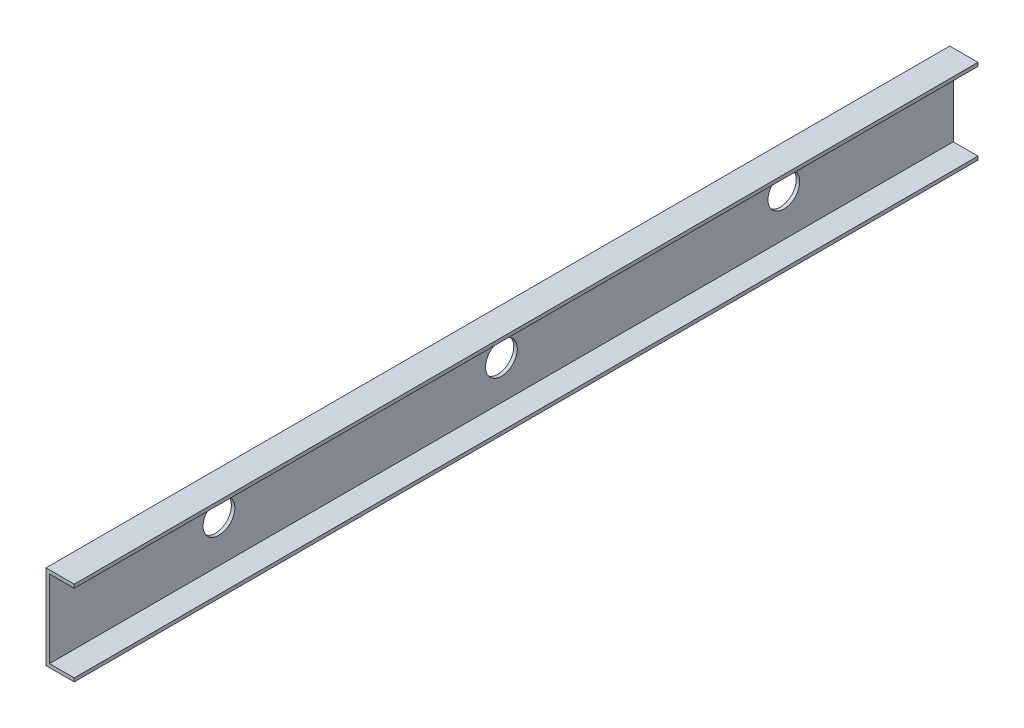
ISO-10303-21;
HEADER;
FILE_DESCRIPTION(('STEP AP214'),'2;1');
FILE_NAME('part.step','',(''),(''),'','','');
FILE_SCHEMA(('AUTOMOTIVE_DESIGN { 1 0 10303 214 1 1 1 1 }'));
ENDSEC;
DATA;
#1=APPLICATION_CONTEXT('core data for automotive mechanical design processes');
#2=APPLICATION_PROTOCOL_DEFINITION('international standard','automotive_design',2000,#1);
#3=PRODUCT_CONTEXT('',#1,'mechanical');
#4=PRODUCT('Part','Part','',(#3));
#5=PRODUCT_RELATED_PRODUCT_CATEGORY('part','',(#4));
#6=PRODUCT_DEFINITION_FORMATION('','',#4);
#7=PRODUCT_DEFINITION_CONTEXT('part definition',#1,'design');
#8=PRODUCT_DEFINITION('design','',#6,#7);
#9=PRODUCT_DEFINITION_SHAPE('','',#8);
#10=(LENGTH_UNIT() NAMED_UNIT(*) SI_UNIT(.MILLI.,.METRE.));
#11=(NAMED_UNIT(*) PLANE_ANGLE_UNIT() SI_UNIT($,.RADIAN.));
#12=(NAMED_UNIT(*) SI_UNIT($,.STERADIAN.) SOLID_ANGLE_UNIT());
#13=UNCERTAINTY_MEASURE_WITH_UNIT(LENGTH_MEASURE(1.E-05),#10,'distance_accuracy_value','');
#14=(GEOMETRIC_REPRESENTATION_CONTEXT(3) GLOBAL_UNCERTAINTY_ASSIGNED_CONTEXT((#13)) GLOBAL_UNIT_ASSIGNED_CONTEXT((#10,
#11,#12)) REPRESENTATION_CONTEXT('',''));
#15=CARTESIAN_POINT('',(0.,0.,0.));
#16=DIRECTION('',(0.,0.,1.));
#17=DIRECTION('',(1.,0.,0.));
#18=AXIS2_PLACEMENT_3D('',#15,#16,#17);
#19=CARTESIAN_POINT('',(22.225,0.,812.8));
#20=DIRECTION('',(0.,-1.,0.));
#21=DIRECTION('',(1.,0.,0.));
#22=AXIS2_PLACEMENT_3D('',#19,#20,#21);
#23=PLANE('',#22);
#24=DIRECTION('',(-1.,0.,0.));
#25=VECTOR('',#24,1.);
#26=CARTESIAN_POINT('',(22.225,0.,0.));
#27=LINE('',#26,#25);
#28=CARTESIAN_POINT('',(22.225,0.,0.));
#29=VERTEX_POINT('',#28);
#30=CARTESIAN_POINT('',(0.,0.,0.));
#31=VERTEX_POINT('',#30);
#32=EDGE_CURVE('E129',#29,#31,#27,.T.);
#33=ORIENTED_EDGE('',*,*,#32,.T.);
#34=DIRECTION('',(0.,0.,-1.));
#35=VECTOR('',#34,1.);
#36=CARTESIAN_POINT('',(0.,0.,812.8));
#37=LINE('',#36,#35);
#38=CARTESIAN_POINT('',(0.,0.,812.8));
#39=VERTEX_POINT('',#38);
#40=EDGE_CURVE('E11',#39,#31,#37,.T.);
#41=ORIENTED_EDGE('',*,*,#40,.F.);
#42=DIRECTION('',(-1.,0.,0.));
#43=VECTOR('',#42,1.);
#44=CARTESIAN_POINT('',(22.225,0.,812.8));
#45=LINE('',#44,#43);
#46=CARTESIAN_POINT('',(22.225,0.,812.8));
#47=VERTEX_POINT('',#46);
#48=EDGE_CURVE('E148',#47,#39,#45,.T.);
#49=ORIENTED_EDGE('',*,*,#48,.F.);
#50=DIRECTION('',(0.,0.,-1.));
#51=VECTOR('',#50,1.);
#52=CARTESIAN_POINT('',(22.225,0.,812.8));
#53=LINE('',#52,#51);
#54=EDGE_CURVE('E125',#47,#29,#53,.T.);
#55=ORIENTED_EDGE('',*,*,#54,.T.);
#56=EDGE_LOOP('',(#33,#41,#49,#55));
#57=FACE_BOUND('',#56,.T.);
#58=ADVANCED_FACE('F33',(#57),#23,.F.);
#59=CARTESIAN_POINT('',(0.,0.,812.8));
#60=DIRECTION('',(-1.,0.,0.));
#61=DIRECTION('',(0.,0.,1.));
#62=AXIS2_PLACEMENT_3D('',#59,#60,#61);
#63=PLANE('',#62);
#64=CARTESIAN_POINT('',(0.,38.1000000000001,660.4));
#65=DIRECTION('',(-1.,0.,0.));
#66=DIRECTION('',(0.,0.,1.));
#67=AXIS2_PLACEMENT_3D('',#64,#65,#66);
#68=CIRCLE('',#67,14.2875);
#69=CARTESIAN_POINT('',(0.,38.1000000000001,674.6875));
#70=VERTEX_POINT('',#69);
#71=EDGE_CURVE('E230',#70,#70,#68,.T.);
#72=ORIENTED_EDGE('',*,*,#71,.T.);
#73=EDGE_LOOP('',(#72));
#74=FACE_BOUND('',#73,.T.);
#75=CARTESIAN_POINT('',(0.,38.1000000000001,152.4));
#76=DIRECTION('',(-1.,0.,0.));
#77=DIRECTION('',(0.,0.,1.));
#78=AXIS2_PLACEMENT_3D('',#75,#76,#77);
#79=CIRCLE('',#78,14.2875);
#80=CARTESIAN_POINT('',(0.,38.1000000000001,166.6875));
#81=VERTEX_POINT('',#80);
#82=EDGE_CURVE('E222',#81,#81,#79,.T.);
#83=ORIENTED_EDGE('',*,*,#82,.T.);
#84=EDGE_LOOP('',(#83));
#85=FACE_BOUND('',#84,.T.);
#86=CARTESIAN_POINT('',(0.,34.9250000000001,406.4));
#87=DIRECTION('',(-1.,0.,0.));
#88=DIRECTION('',(0.,0.,1.));
#89=AXIS2_PLACEMENT_3D('',#86,#87,#88);
#90=CIRCLE('',#89,14.2875);
#91=CARTESIAN_POINT('',(0.,34.9250000000001,420.6875));
#92=VERTEX_POINT('',#91);
#93=EDGE_CURVE('E133',#92,#92,#90,.T.);
#94=ORIENTED_EDGE('',*,*,#93,.T.);
#95=EDGE_LOOP('',(#94));
#96=FACE_BOUND('',#95,.T.);
#97=DIRECTION('',(0.,1.,0.));
#98=VECTOR('',#97,1.);
#99=CARTESIAN_POINT('',(0.,0.,0.));
#100=LINE('',#99,#98);
#101=CARTESIAN_POINT('',(0.,69.85,0.));
#102=VERTEX_POINT('',#101);
#103=EDGE_CURVE('E132',#31,#102,#100,.T.);
#104=ORIENTED_EDGE('',*,*,#103,.T.);
#105=DIRECTION('',(0.,0.,-1.));
#106=VECTOR('',#105,1.);
#107=CARTESIAN_POINT('',(0.,69.85,812.8));
#108=LINE('',#107,#106);
#109=CARTESIAN_POINT('',(0.,69.85,812.8));
#110=VERTEX_POINT('',#109);
#111=EDGE_CURVE('E41',#110,#102,#108,.T.);
#112=ORIENTED_EDGE('',*,*,#111,.F.);
#113=DIRECTION('',(0.,1.,0.));
#114=VECTOR('',#113,1.);
#115=CARTESIAN_POINT('',(0.,0.,812.8));
#116=LINE('',#115,#114);
#117=EDGE_CURVE('E92',#39,#110,#116,.T.);
#118=ORIENTED_EDGE('',*,*,#117,.F.);
#119=ORIENTED_EDGE('',*,*,#40,.T.);
#120=EDGE_LOOP('',(#104,#112,#118,#119));
#121=FACE_BOUND('',#120,.T.);
#122=ADVANCED_FACE('F161',(#74,#85,#96,#121),#63,.F.);
#123=CARTESIAN_POINT('',(22.225,69.85,812.8));
#124=DIRECTION('',(0.,-1.,0.));
#125=DIRECTION('',(0.,0.,-1.));
#126=AXIS2_PLACEMENT_3D('',#123,#124,#125);
#127=PLANE('',#126);
#128=DIRECTION('',(-1.,0.,0.));
#129=VECTOR('',#128,1.);
#130=CARTESIAN_POINT('',(22.225,69.85,0.));
#131=LINE('',#130,#129);
#132=CARTESIAN_POINT('',(22.225,69.85,0.));
#133=VERTEX_POINT('',#132);
#134=EDGE_CURVE('E136',#133,#102,#131,.T.);
#135=ORIENTED_EDGE('',*,*,#134,.F.);
#136=DIRECTION('',(0.,0.,-1.));
#137=VECTOR('',#136,1.);
#138=CARTESIAN_POINT('',(22.225,69.85,812.8));
#139=LINE('',#138,#137);
#140=CARTESIAN_POINT('',(22.225,69.85,812.8));
#141=VERTEX_POINT('',#140);
#142=EDGE_CURVE('E154',#141,#133,#139,.T.);
#143=ORIENTED_EDGE('',*,*,#142,.F.);
#144=DIRECTION('',(-1.,0.,0.));
#145=VECTOR('',#144,1.);
#146=CARTESIAN_POINT('',(22.225,69.85,812.8));
#147=LINE('',#146,#145);
#148=EDGE_CURVE('E160',#141,#110,#147,.T.);
#149=ORIENTED_EDGE('',*,*,#148,.T.);
#150=ORIENTED_EDGE('',*,*,#111,.T.);
#151=EDGE_LOOP('',(#135,#143,#149,#150));
#152=FACE_BOUND('',#151,.T.);
#153=ADVANCED_FACE('F158',(#152),#127,.T.);
#154=CARTESIAN_POINT('',(22.225,73.025,812.8));
#155=DIRECTION('',(1.,0.,0.));
#156=DIRECTION('',(0.,0.,-1.));
#157=AXIS2_PLACEMENT_3D('',#154,#155,#156);
#158=PLANE('',#157);
#159=DIRECTION('',(0.,-1.,0.));
#160=VECTOR('',#159,1.);
#161=CARTESIAN_POINT('',(22.225,73.025,0.));
#162=LINE('',#161,#160);
#163=CARTESIAN_POINT('',(22.225,73.025,0.));
#164=VERTEX_POINT('',#163);
#165=EDGE_CURVE('E139',#164,#133,#162,.T.);
#166=ORIENTED_EDGE('',*,*,#165,.F.);
#167=DIRECTION('',(0.,0.,-1.));
#168=VECTOR('',#167,1.);
#169=CARTESIAN_POINT('',(22.225,73.025,812.8));
#170=LINE('',#169,#168);
#171=CARTESIAN_POINT('',(22.225,73.025,812.8));
#172=VERTEX_POINT('',#171);
#173=EDGE_CURVE('E152',#172,#164,#170,.T.);
#174=ORIENTED_EDGE('',*,*,#173,.F.);
#175=DIRECTION('',(0.,-1.,0.));
#176=VECTOR('',#175,1.);
#177=CARTESIAN_POINT('',(22.225,73.025,812.8));
#178=LINE('',#177,#176);
#179=EDGE_CURVE('E171',#172,#141,#178,.T.);
#180=ORIENTED_EDGE('',*,*,#179,.T.);
#181=ORIENTED_EDGE('',*,*,#142,.T.);
#182=EDGE_LOOP('',(#166,#174,#180,#181));
#183=FACE_BOUND('',#182,.T.);
#184=ADVANCED_FACE('F169',(#183),#158,.T.);
#185=CARTESIAN_POINT('',(-3.175,73.025,812.8));
#186=DIRECTION('',(0.,1.,0.));
#187=DIRECTION('',(0.,0.,1.));
#188=AXIS2_PLACEMENT_3D('',#185,#186,#187);
#189=PLANE('',#188);
#190=DIRECTION('',(1.,0.,0.));
#191=VECTOR('',#190,1.);
#192=CARTESIAN_POINT('',(-3.175,73.025,0.));
#193=LINE('',#192,#191);
#194=CARTESIAN_POINT('',(-3.175,73.025,0.));
#195=VERTEX_POINT('',#194);
#196=EDGE_CURVE('E142',#195,#164,#193,.T.);
#197=ORIENTED_EDGE('',*,*,#196,.F.);
#198=DIRECTION('',(0.,0.,-1.));
#199=VECTOR('',#198,1.);
#200=CARTESIAN_POINT('',(-3.175,73.025,812.8));
#201=LINE('',#200,#199);
#202=CARTESIAN_POINT('',(-3.175,73.025,812.8));
#203=VERTEX_POINT('',#202);
#204=EDGE_CURVE('E120',#203,#195,#201,.T.);
#205=ORIENTED_EDGE('',*,*,#204,.F.);
#206=DIRECTION('',(1.,0.,0.));
#207=VECTOR('',#206,1.);
#208=CARTESIAN_POINT('',(-3.175,73.025,812.8));
#209=LINE('',#208,#207);
#210=EDGE_CURVE('E113',#203,#172,#209,.T.);
#211=ORIENTED_EDGE('',*,*,#210,.T.);
#212=ORIENTED_EDGE('',*,*,#173,.T.);
#213=EDGE_LOOP('',(#197,#205,#211,#212));
#214=FACE_BOUND('',#213,.T.);
#215=ADVANCED_FACE('F177',(#214),#189,.T.);
#216=CARTESIAN_POINT('',(-3.175,73.025,812.8));
#217=DIRECTION('',(1.,0.,0.));
#218=DIRECTION('',(0.,1.,0.));
#219=AXIS2_PLACEMENT_3D('',#216,#217,#218);
#220=PLANE('',#219);
#221=CARTESIAN_POINT('',(-3.175,38.1000000000001,660.4));
#222=DIRECTION('',(-1.,0.,0.));
#223=DIRECTION('',(0.,-1.,0.));
#224=AXIS2_PLACEMENT_3D('',#221,#222,#223);
#225=CIRCLE('',#224,14.2875);
#226=CARTESIAN_POINT('',(-3.17499999999999,23.8125,660.4));
#227=VERTEX_POINT('',#226);
#228=EDGE_CURVE('E213',#227,#227,#225,.T.);
#229=ORIENTED_EDGE('',*,*,#228,.F.);
#230=EDGE_LOOP('',(#229));
#231=FACE_BOUND('',#230,.T.);
#232=CARTESIAN_POINT('',(-3.175,38.1000000000001,152.4));
#233=DIRECTION('',(-1.,0.,0.));
#234=DIRECTION('',(0.,-1.,0.));
#235=AXIS2_PLACEMENT_3D('',#232,#233,#234);
#236=CIRCLE('',#235,14.2875);
#237=CARTESIAN_POINT('',(-3.17499999999999,23.8125000000001,152.4));
#238=VERTEX_POINT('',#237);
#239=EDGE_CURVE('E217',#238,#238,#236,.T.);
#240=ORIENTED_EDGE('',*,*,#239,.F.);
#241=EDGE_LOOP('',(#240));
#242=FACE_BOUND('',#241,.T.);
#243=CARTESIAN_POINT('',(-3.17499999999999,34.9250000000001,406.4));
#244=DIRECTION('',(-1.,0.,0.));
#245=DIRECTION('',(0.,-1.,0.));
#246=AXIS2_PLACEMENT_3D('',#243,#244,#245);
#247=CIRCLE('',#246,14.2875);
#248=CARTESIAN_POINT('',(-3.17499999999999,20.6375000000001,406.4));
#249=VERTEX_POINT('',#248);
#250=EDGE_CURVE('E220',#249,#249,#247,.T.);
#251=ORIENTED_EDGE('',*,*,#250,.F.);
#252=EDGE_LOOP('',(#251));
#253=FACE_BOUND('',#252,.T.);
#254=DIRECTION('',(0.,-1.,0.));
#255=VECTOR('',#254,1.);
#256=CARTESIAN_POINT('',(-3.175,73.025,0.));
#257=LINE('',#256,#255);
#258=CARTESIAN_POINT('',(-3.17499999999999,-3.175,0.));
#259=VERTEX_POINT('',#258);
#260=EDGE_CURVE('E119',#195,#259,#257,.T.);
#261=ORIENTED_EDGE('',*,*,#260,.T.);
#262=DIRECTION('',(0.,0.,-1.));
#263=VECTOR('',#262,1.);
#264=CARTESIAN_POINT('',(-3.17499999999999,-3.175,812.8));
#265=LINE('',#264,#263);
#266=CARTESIAN_POINT('',(-3.17499999999999,-3.175,812.8));
#267=VERTEX_POINT('',#266);
#268=EDGE_CURVE('E116',#267,#259,#265,.T.);
#269=ORIENTED_EDGE('',*,*,#268,.F.);
#270=DIRECTION('',(0.,-1.,0.));
#271=VECTOR('',#270,1.);
#272=CARTESIAN_POINT('',(-3.175,73.025,812.8));
#273=LINE('',#272,#271);
#274=EDGE_CURVE('E106',#203,#267,#273,.T.);
#275=ORIENTED_EDGE('',*,*,#274,.F.);
#276=ORIENTED_EDGE('',*,*,#204,.T.);
#277=EDGE_LOOP('',(#261,#269,#275,#276));
#278=FACE_BOUND('',#277,.T.);
#279=ADVANCED_FACE('F117',(#231,#242,#253,#278),#220,.F.);
#280=CARTESIAN_POINT('',(-3.17499999999999,-3.175,812.8));
#281=DIRECTION('',(0.,1.,0.));
#282=DIRECTION('',(-1.,0.,0.));
#283=AXIS2_PLACEMENT_3D('',#280,#281,#282);
#284=PLANE('',#283);
#285=DIRECTION('',(1.,0.,0.));
#286=VECTOR('',#285,1.);
#287=CARTESIAN_POINT('',(-3.17499999999999,-3.175,0.));
#288=LINE('',#287,#286);
#289=CARTESIAN_POINT('',(22.225,-3.175,0.));
#290=VERTEX_POINT('',#289);
#291=EDGE_CURVE('E78',#259,#290,#288,.T.);
#292=ORIENTED_EDGE('',*,*,#291,.T.);
#293=DIRECTION('',(0.,0.,-1.));
#294=VECTOR('',#293,1.);
#295=CARTESIAN_POINT('',(22.225,-3.175,812.8));
#296=LINE('',#295,#294);
#297=CARTESIAN_POINT('',(22.225,-3.175,812.8));
#298=VERTEX_POINT('',#297);
#299=EDGE_CURVE('E121',#298,#290,#296,.T.);
#300=ORIENTED_EDGE('',*,*,#299,.F.);
#301=DIRECTION('',(1.,0.,0.));
#302=VECTOR('',#301,1.);
#303=CARTESIAN_POINT('',(-3.17499999999999,-3.175,812.8));
#304=LINE('',#303,#302);
#305=EDGE_CURVE('E110',#267,#298,#304,.T.);
#306=ORIENTED_EDGE('',*,*,#305,.F.);
#307=ORIENTED_EDGE('',*,*,#268,.T.);
#308=EDGE_LOOP('',(#292,#300,#306,#307));
#309=FACE_BOUND('',#308,.T.);
#310=ADVANCED_FACE('F123',(#309),#284,.F.);
#311=CARTESIAN_POINT('',(22.225,-3.175,812.8));
#312=DIRECTION('',(-1.,0.,0.));
#313=DIRECTION('',(0.,0.,1.));
#314=AXIS2_PLACEMENT_3D('',#311,#312,#313);
#315=PLANE('',#314);
#316=DIRECTION('',(0.,1.,0.));
#317=VECTOR('',#316,1.);
#318=CARTESIAN_POINT('',(22.225,-3.175,0.));
#319=LINE('',#318,#317);
#320=EDGE_CURVE('E84',#290,#29,#319,.T.);
#321=ORIENTED_EDGE('',*,*,#320,.T.);
#322=ORIENTED_EDGE('',*,*,#54,.F.);
#323=DIRECTION('',(0.,1.,0.));
#324=VECTOR('',#323,1.);
#325=CARTESIAN_POINT('',(22.225,-3.175,812.8));
#326=LINE('',#325,#324);
#327=EDGE_CURVE('E49',#298,#47,#326,.T.);
#328=ORIENTED_EDGE('',*,*,#327,.F.);
#329=ORIENTED_EDGE('',*,*,#299,.T.);
#330=EDGE_LOOP('',(#321,#322,#328,#329));
#331=FACE_BOUND('',#330,.T.);
#332=ADVANCED_FACE('F180',(#331),#315,.F.);
#333=CARTESIAN_POINT('',(0.,0.,812.8));
#334=DIRECTION('',(0.,0.,-1.));
#335=DIRECTION('',(-1.,0.,0.));
#336=AXIS2_PLACEMENT_3D('',#333,#334,#335);
#337=PLANE('',#336);
#338=ORIENTED_EDGE('',*,*,#48,.T.);
#339=ORIENTED_EDGE('',*,*,#117,.T.);
#340=ORIENTED_EDGE('',*,*,#148,.F.);
#341=ORIENTED_EDGE('',*,*,#179,.F.);
#342=ORIENTED_EDGE('',*,*,#210,.F.);
#343=ORIENTED_EDGE('',*,*,#274,.T.);
#344=ORIENTED_EDGE('',*,*,#305,.T.);
#345=ORIENTED_EDGE('',*,*,#327,.T.);
#346=EDGE_LOOP('',(#338,#339,#340,#341,#342,#343,#344,#345));
#347=FACE_BOUND('',#346,.T.);
#348=ADVANCED_FACE('F108',(#347),#337,.F.);
#349=CARTESIAN_POINT('',(0.,0.,0.));
#350=DIRECTION('',(0.,0.,-1.));
#351=DIRECTION('',(-1.,0.,0.));
#352=AXIS2_PLACEMENT_3D('',#349,#350,#351);
#353=PLANE('',#352);
#354=ORIENTED_EDGE('',*,*,#32,.F.);
#355=ORIENTED_EDGE('',*,*,#320,.F.);
#356=ORIENTED_EDGE('',*,*,#291,.F.);
#357=ORIENTED_EDGE('',*,*,#260,.F.);
#358=ORIENTED_EDGE('',*,*,#196,.T.);
#359=ORIENTED_EDGE('',*,*,#165,.T.);
#360=ORIENTED_EDGE('',*,*,#134,.T.);
#361=ORIENTED_EDGE('',*,*,#103,.F.);
#362=EDGE_LOOP('',(#354,#355,#356,#357,#358,#359,#360,#361));
#363=FACE_BOUND('',#362,.T.);
#364=ADVANCED_FACE('F165',(#363),#353,.T.);
#365=CARTESIAN_POINT('',(22.225,34.9250000000001,406.4));
#366=DIRECTION('',(-1.,0.,0.));
#367=DIRECTION('',(0.,-1.,0.));
#368=AXIS2_PLACEMENT_3D('',#365,#366,#367);
#369=CYLINDRICAL_SURFACE('',#368,14.2875);
#370=ORIENTED_EDGE('',*,*,#250,.T.);
#371=EDGE_LOOP('',(#370));
#372=FACE_BOUND('',#371,.T.);
#373=ORIENTED_EDGE('',*,*,#93,.F.);
#374=EDGE_LOOP('',(#373));
#375=FACE_BOUND('',#374,.T.);
#376=ADVANCED_FACE('F242',(#372,#375),#369,.F.);
#377=CARTESIAN_POINT('',(22.225,38.1000000000001,152.4));
#378=DIRECTION('',(-1.,0.,0.));
#379=DIRECTION('',(0.,-1.,0.));
#380=AXIS2_PLACEMENT_3D('',#377,#378,#379);
#381=CYLINDRICAL_SURFACE('',#380,14.2875);
#382=ORIENTED_EDGE('',*,*,#239,.T.);
#383=EDGE_LOOP('',(#382));
#384=FACE_BOUND('',#383,.T.);
#385=ORIENTED_EDGE('',*,*,#82,.F.);
#386=EDGE_LOOP('',(#385));
#387=FACE_BOUND('',#386,.T.);
#388=ADVANCED_FACE('F236',(#384,#387),#381,.F.);
#389=CARTESIAN_POINT('',(22.225,38.1000000000001,660.4));
#390=DIRECTION('',(-1.,0.,0.));
#391=DIRECTION('',(0.,-1.,0.));
#392=AXIS2_PLACEMENT_3D('',#389,#390,#391);
#393=CYLINDRICAL_SURFACE('',#392,14.2875);
#394=ORIENTED_EDGE('',*,*,#228,.T.);
#395=EDGE_LOOP('',(#394));
#396=FACE_BOUND('',#395,.T.);
#397=ORIENTED_EDGE('',*,*,#71,.F.);
#398=EDGE_LOOP('',(#397));
#399=FACE_BOUND('',#398,.T.);
#400=ADVANCED_FACE('F233',(#396,#399),#393,.F.);
#401=CLOSED_SHELL('',(#58,#122,#153,#184,#215,#279,#310,#332,#348,#364,#376,#388,#400));
#402=MANIFOLD_SOLID_BREP('B2',#401);
#403=ADVANCED_BREP_SHAPE_REPRESENTATION('',(#18,#402),#14);
#404=SHAPE_DEFINITION_REPRESENTATION(#9,#403);
ENDSEC;
END-ISO-10303-21;
